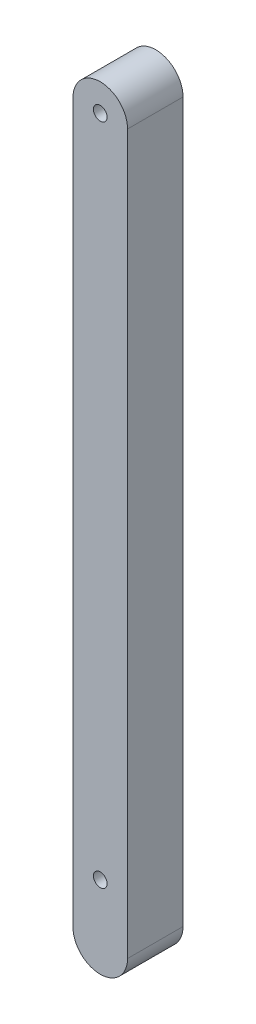
ISO-10303-21;
HEADER;
FILE_DESCRIPTION(('STEP AP214'),'2;1');
FILE_NAME('part.step','',(''),(''),'','','');
FILE_SCHEMA(('AUTOMOTIVE_DESIGN { 1 0 10303 214 1 1 1 1 }'));
ENDSEC;
DATA;
#1=APPLICATION_CONTEXT('core data for automotive mechanical design processes');
#2=APPLICATION_PROTOCOL_DEFINITION('international standard','automotive_design',2000,#1);
#3=PRODUCT_CONTEXT('',#1,'mechanical');
#4=PRODUCT('Part','Part','',(#3));
#5=PRODUCT_RELATED_PRODUCT_CATEGORY('part','',(#4));
#6=PRODUCT_DEFINITION_FORMATION('','',#4);
#7=PRODUCT_DEFINITION_CONTEXT('part definition',#1,'design');
#8=PRODUCT_DEFINITION('design','',#6,#7);
#9=PRODUCT_DEFINITION_SHAPE('','',#8);
#10=(LENGTH_UNIT() NAMED_UNIT(*) SI_UNIT(.MILLI.,.METRE.));
#11=(NAMED_UNIT(*) PLANE_ANGLE_UNIT() SI_UNIT($,.RADIAN.));
#12=(NAMED_UNIT(*) SI_UNIT($,.STERADIAN.) SOLID_ANGLE_UNIT());
#13=UNCERTAINTY_MEASURE_WITH_UNIT(LENGTH_MEASURE(1.E-05),#10,'distance_accuracy_value','');
#14=(GEOMETRIC_REPRESENTATION_CONTEXT(3) GLOBAL_UNCERTAINTY_ASSIGNED_CONTEXT((#13)) GLOBAL_UNIT_ASSIGNED_CONTEXT((#10,
#11,#12)) REPRESENTATION_CONTEXT('',''));
#15=CARTESIAN_POINT('',(0.,0.,0.));
#16=DIRECTION('',(0.,0.,1.));
#17=DIRECTION('',(1.,0.,0.));
#18=AXIS2_PLACEMENT_3D('',#15,#16,#17);
#19=CARTESIAN_POINT('',(0.,63.6097560975608,12.2));
#20=DIRECTION('',(0.,0.,1.));
#21=DIRECTION('',(1.,0.,0.));
#22=AXIS2_PLACEMENT_3D('',#19,#20,#21);
#23=PLANE('',#22);
#24=CARTESIAN_POINT('',(0.,-82.3902439024392,12.2));
#25=DIRECTION('',(0.,0.,1.));
#26=DIRECTION('',(1.,0.,0.));
#27=AXIS2_PLACEMENT_3D('',#24,#25,#26);
#28=CIRCLE('',#27,1.5);
#29=CARTESIAN_POINT('',(1.50000000000002,-82.3902439024392,12.2));
#30=VERTEX_POINT('',#29);
#31=EDGE_CURVE('E112',#30,#30,#28,.T.);
#32=ORIENTED_EDGE('',*,*,#31,.F.);
#33=EDGE_LOOP('',(#32));
#34=FACE_BOUND('',#33,.T.);
#35=CARTESIAN_POINT('',(0.,63.6097560975608,12.2));
#36=DIRECTION('',(0.,0.,1.));
#37=DIRECTION('',(1.,0.,0.));
#38=AXIS2_PLACEMENT_3D('',#35,#36,#37);
#39=CIRCLE('',#38,6.);
#40=CARTESIAN_POINT('',(6.,63.6097560975608,12.2));
#41=VERTEX_POINT('',#40);
#42=CARTESIAN_POINT('',(-6.,63.6097560975608,12.2));
#43=VERTEX_POINT('',#42);
#44=EDGE_CURVE('E92',#41,#43,#39,.T.);
#45=ORIENTED_EDGE('',*,*,#44,.T.);
#46=DIRECTION('',(0.,-1.,0.));
#47=VECTOR('',#46,1.);
#48=CARTESIAN_POINT('',(-6.,63.6097560975608,12.2));
#49=LINE('',#48,#47);
#50=CARTESIAN_POINT('',(-6.,-94.3902439024392,12.2));
#51=VERTEX_POINT('',#50);
#52=EDGE_CURVE('E87',#43,#51,#49,.T.);
#53=ORIENTED_EDGE('',*,*,#52,.T.);
#54=CARTESIAN_POINT('',(0.,-94.3902439024392,12.2));
#55=DIRECTION('',(0.,0.,1.));
#56=DIRECTION('',(1.,0.,0.));
#57=AXIS2_PLACEMENT_3D('',#54,#55,#56);
#58=CIRCLE('',#57,6.);
#59=CARTESIAN_POINT('',(6.00000000000002,-94.3902439024392,12.2));
#60=VERTEX_POINT('',#59);
#61=EDGE_CURVE('E90',#51,#60,#58,.T.);
#62=ORIENTED_EDGE('',*,*,#61,.T.);
#63=DIRECTION('',(0.,1.,0.));
#64=VECTOR('',#63,1.);
#65=CARTESIAN_POINT('',(6.,63.6097560975608,12.2));
#66=LINE('',#65,#64);
#67=EDGE_CURVE('E57',#60,#41,#66,.T.);
#68=ORIENTED_EDGE('',*,*,#67,.T.);
#69=EDGE_LOOP('',(#45,#53,#62,#68));
#70=FACE_BOUND('',#69,.T.);
#71=CARTESIAN_POINT('',(0.,63.6097560975608,12.2));
#72=DIRECTION('',(0.,0.,1.));
#73=DIRECTION('',(1.,0.,0.));
#74=AXIS2_PLACEMENT_3D('',#71,#72,#73);
#75=CIRCLE('',#74,1.5);
#76=CARTESIAN_POINT('',(1.5,63.6097560975608,12.2));
#77=VERTEX_POINT('',#76);
#78=EDGE_CURVE('E134',#77,#77,#75,.T.);
#79=ORIENTED_EDGE('',*,*,#78,.F.);
#80=EDGE_LOOP('',(#79));
#81=FACE_BOUND('',#80,.T.);
#82=ADVANCED_FACE('F39',(#34,#70,#81),#23,.T.);
#83=CARTESIAN_POINT('',(0.,63.6097560975608,0.));
#84=DIRECTION('',(0.,0.,1.));
#85=DIRECTION('',(1.,0.,0.));
#86=AXIS2_PLACEMENT_3D('',#83,#84,#85);
#87=PLANE('',#86);
#88=CARTESIAN_POINT('',(0.,63.6097560975608,0.));
#89=DIRECTION('',(0.,0.,1.));
#90=DIRECTION('',(1.,0.,0.));
#91=AXIS2_PLACEMENT_3D('',#88,#89,#90);
#92=CIRCLE('',#91,6.);
#93=CARTESIAN_POINT('',(6.,63.6097560975608,0.));
#94=VERTEX_POINT('',#93);
#95=CARTESIAN_POINT('',(-6.,63.6097560975608,0.));
#96=VERTEX_POINT('',#95);
#97=EDGE_CURVE('E108',#94,#96,#92,.T.);
#98=ORIENTED_EDGE('',*,*,#97,.F.);
#99=DIRECTION('',(0.,1.,0.));
#100=VECTOR('',#99,1.);
#101=CARTESIAN_POINT('',(6.,63.6097560975608,0.));
#102=LINE('',#101,#100);
#103=CARTESIAN_POINT('',(6.00000000000002,-94.3902439024392,0.));
#104=VERTEX_POINT('',#103);
#105=EDGE_CURVE('E80',#104,#94,#102,.T.);
#106=ORIENTED_EDGE('',*,*,#105,.F.);
#107=CARTESIAN_POINT('',(0.,-94.3902439024392,0.));
#108=DIRECTION('',(0.,0.,1.));
#109=DIRECTION('',(1.,0.,0.));
#110=AXIS2_PLACEMENT_3D('',#107,#108,#109);
#111=CIRCLE('',#110,6.);
#112=CARTESIAN_POINT('',(-6.,-94.3902439024392,0.));
#113=VERTEX_POINT('',#112);
#114=EDGE_CURVE('E74',#113,#104,#111,.T.);
#115=ORIENTED_EDGE('',*,*,#114,.F.);
#116=DIRECTION('',(0.,-1.,0.));
#117=VECTOR('',#116,1.);
#118=CARTESIAN_POINT('',(-6.,63.6097560975608,0.));
#119=LINE('',#118,#117);
#120=EDGE_CURVE('E97',#96,#113,#119,.T.);
#121=ORIENTED_EDGE('',*,*,#120,.F.);
#122=EDGE_LOOP('',(#98,#106,#115,#121));
#123=FACE_BOUND('',#122,.T.);
#124=CARTESIAN_POINT('',(0.,-82.3902439024392,0.));
#125=DIRECTION('',(0.,0.,1.));
#126=DIRECTION('',(1.,0.,0.));
#127=AXIS2_PLACEMENT_3D('',#124,#125,#126);
#128=CIRCLE('',#127,1.5);
#129=CARTESIAN_POINT('',(1.50000000000002,-82.3902439024392,0.));
#130=VERTEX_POINT('',#129);
#131=EDGE_CURVE('E130',#130,#130,#128,.T.);
#132=ORIENTED_EDGE('',*,*,#131,.T.);
#133=EDGE_LOOP('',(#132));
#134=FACE_BOUND('',#133,.T.);
#135=CARTESIAN_POINT('',(0.,63.6097560975608,0.));
#136=DIRECTION('',(0.,0.,1.));
#137=DIRECTION('',(1.,0.,0.));
#138=AXIS2_PLACEMENT_3D('',#135,#136,#137);
#139=CIRCLE('',#138,1.5);
#140=CARTESIAN_POINT('',(1.5,63.6097560975608,0.));
#141=VERTEX_POINT('',#140);
#142=EDGE_CURVE('E138',#141,#141,#139,.T.);
#143=ORIENTED_EDGE('',*,*,#142,.T.);
#144=EDGE_LOOP('',(#143));
#145=FACE_BOUND('',#144,.T.);
#146=ADVANCED_FACE('F125',(#123,#134,#145),#87,.F.);
#147=CARTESIAN_POINT('',(0.,63.6097560975608,12.2));
#148=DIRECTION('',(0.,0.,-1.));
#149=DIRECTION('',(-1.,0.,0.));
#150=AXIS2_PLACEMENT_3D('',#147,#148,#149);
#151=CYLINDRICAL_SURFACE('',#150,6.);
#152=ORIENTED_EDGE('',*,*,#97,.T.);
#153=DIRECTION('',(0.,0.,-1.));
#154=VECTOR('',#153,1.);
#155=CARTESIAN_POINT('',(-6.,63.6097560975608,12.2));
#156=LINE('',#155,#154);
#157=EDGE_CURVE('E11',#43,#96,#156,.T.);
#158=ORIENTED_EDGE('',*,*,#157,.F.);
#159=ORIENTED_EDGE('',*,*,#44,.F.);
#160=DIRECTION('',(0.,0.,-1.));
#161=VECTOR('',#160,1.);
#162=CARTESIAN_POINT('',(6.,63.6097560975608,12.2));
#163=LINE('',#162,#161);
#164=EDGE_CURVE('E104',#41,#94,#163,.T.);
#165=ORIENTED_EDGE('',*,*,#164,.T.);
#166=EDGE_LOOP('',(#152,#158,#159,#165));
#167=FACE_BOUND('',#166,.T.);
#168=ADVANCED_FACE('F41',(#167),#151,.T.);
#169=CARTESIAN_POINT('',(-6.,63.6097560975608,12.2));
#170=DIRECTION('',(1.,0.,0.));
#171=DIRECTION('',(0.,1.,0.));
#172=AXIS2_PLACEMENT_3D('',#169,#170,#171);
#173=PLANE('',#172);
#174=ORIENTED_EDGE('',*,*,#120,.T.);
#175=DIRECTION('',(0.,0.,-1.));
#176=VECTOR('',#175,1.);
#177=CARTESIAN_POINT('',(-6.,-94.3902439024392,12.2));
#178=LINE('',#177,#176);
#179=EDGE_CURVE('E49',#51,#113,#178,.T.);
#180=ORIENTED_EDGE('',*,*,#179,.F.);
#181=ORIENTED_EDGE('',*,*,#52,.F.);
#182=ORIENTED_EDGE('',*,*,#157,.T.);
#183=EDGE_LOOP('',(#174,#180,#181,#182));
#184=FACE_BOUND('',#183,.T.);
#185=ADVANCED_FACE('F96',(#184),#173,.F.);
#186=CARTESIAN_POINT('',(0.,-94.3902439024392,12.2));
#187=DIRECTION('',(0.,0.,-1.));
#188=DIRECTION('',(-1.,0.,0.));
#189=AXIS2_PLACEMENT_3D('',#186,#187,#188);
#190=CYLINDRICAL_SURFACE('',#189,6.);
#191=ORIENTED_EDGE('',*,*,#114,.T.);
#192=DIRECTION('',(0.,0.,-1.));
#193=VECTOR('',#192,1.);
#194=CARTESIAN_POINT('',(6.00000000000002,-94.3902439024392,12.2));
#195=LINE('',#194,#193);
#196=EDGE_CURVE('E99',#60,#104,#195,.T.);
#197=ORIENTED_EDGE('',*,*,#196,.F.);
#198=ORIENTED_EDGE('',*,*,#61,.F.);
#199=ORIENTED_EDGE('',*,*,#179,.T.);
#200=EDGE_LOOP('',(#191,#197,#198,#199));
#201=FACE_BOUND('',#200,.T.);
#202=ADVANCED_FACE('F100',(#201),#190,.T.);
#203=CARTESIAN_POINT('',(6.,63.6097560975608,12.2));
#204=DIRECTION('',(-1.,0.,0.));
#205=DIRECTION('',(0.,-1.,0.));
#206=AXIS2_PLACEMENT_3D('',#203,#204,#205);
#207=PLANE('',#206);
#208=ORIENTED_EDGE('',*,*,#105,.T.);
#209=ORIENTED_EDGE('',*,*,#164,.F.);
#210=ORIENTED_EDGE('',*,*,#67,.F.);
#211=ORIENTED_EDGE('',*,*,#196,.T.);
#212=EDGE_LOOP('',(#208,#209,#210,#211));
#213=FACE_BOUND('',#212,.T.);
#214=ADVANCED_FACE('F122',(#213),#207,.F.);
#215=CARTESIAN_POINT('',(0.,-82.3902439024392,12.2));
#216=DIRECTION('',(0.,0.,-1.));
#217=DIRECTION('',(-1.,0.,0.));
#218=AXIS2_PLACEMENT_3D('',#215,#216,#217);
#219=CYLINDRICAL_SURFACE('',#218,1.5);
#220=ORIENTED_EDGE('',*,*,#31,.T.);
#221=EDGE_LOOP('',(#220));
#222=FACE_BOUND('',#221,.T.);
#223=ORIENTED_EDGE('',*,*,#131,.F.);
#224=EDGE_LOOP('',(#223));
#225=FACE_BOUND('',#224,.T.);
#226=ADVANCED_FACE('F157',(#222,#225),#219,.F.);
#227=CARTESIAN_POINT('',(0.,63.6097560975608,12.2));
#228=DIRECTION('',(0.,0.,-1.));
#229=DIRECTION('',(-1.,0.,0.));
#230=AXIS2_PLACEMENT_3D('',#227,#228,#229);
#231=CYLINDRICAL_SURFACE('',#230,1.5);
#232=ORIENTED_EDGE('',*,*,#78,.T.);
#233=EDGE_LOOP('',(#232));
#234=FACE_BOUND('',#233,.T.);
#235=ORIENTED_EDGE('',*,*,#142,.F.);
#236=EDGE_LOOP('',(#235));
#237=FACE_BOUND('',#236,.T.);
#238=ADVANCED_FACE('F146',(#234,#237),#231,.F.);
#239=CLOSED_SHELL('',(#82,#146,#168,#185,#202,#214,#226,#238));
#240=MANIFOLD_SOLID_BREP('B2',#239);
#241=ADVANCED_BREP_SHAPE_REPRESENTATION('',(#18,#240),#14);
#242=SHAPE_DEFINITION_REPRESENTATION(#9,#241);
ENDSEC;
END-ISO-10303-21;
